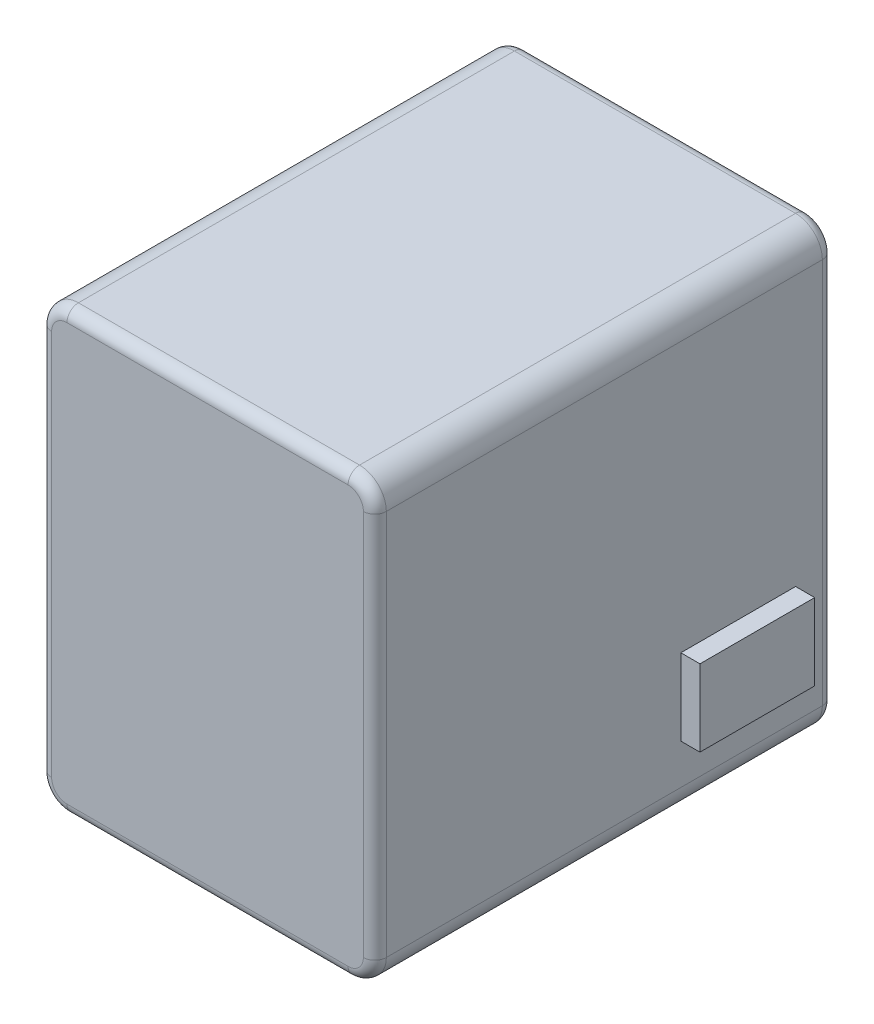
ISO-10303-21;
HEADER;
FILE_DESCRIPTION(('STEP AP214'),'2;1');
FILE_NAME('part.step','',(''),(''),'','','');
FILE_SCHEMA(('AUTOMOTIVE_DESIGN { 1 0 10303 214 1 1 1 1 }'));
ENDSEC;
DATA;
#1=APPLICATION_CONTEXT('core data for automotive mechanical design processes');
#2=APPLICATION_PROTOCOL_DEFINITION('international standard','automotive_design',2000,#1);
#3=PRODUCT_CONTEXT('',#1,'mechanical');
#4=PRODUCT('Part','Part','',(#3));
#5=PRODUCT_RELATED_PRODUCT_CATEGORY('part','',(#4));
#6=PRODUCT_DEFINITION_FORMATION('','',#4);
#7=PRODUCT_DEFINITION_CONTEXT('part definition',#1,'design');
#8=PRODUCT_DEFINITION('design','',#6,#7);
#9=PRODUCT_DEFINITION_SHAPE('','',#8);
#10=(LENGTH_UNIT() NAMED_UNIT(*) SI_UNIT(.MILLI.,.METRE.));
#11=(NAMED_UNIT(*) PLANE_ANGLE_UNIT() SI_UNIT($,.RADIAN.));
#12=(NAMED_UNIT(*) SI_UNIT($,.STERADIAN.) SOLID_ANGLE_UNIT());
#13=UNCERTAINTY_MEASURE_WITH_UNIT(LENGTH_MEASURE(1.E-05),#10,'distance_accuracy_value','');
#14=(GEOMETRIC_REPRESENTATION_CONTEXT(3) GLOBAL_UNCERTAINTY_ASSIGNED_CONTEXT((#13)) GLOBAL_UNIT_ASSIGNED_CONTEXT((#10,
#11,#12)) REPRESENTATION_CONTEXT('',''));
#15=CARTESIAN_POINT('',(0.,0.,0.));
#16=DIRECTION('',(0.,0.,1.));
#17=DIRECTION('',(1.,0.,0.));
#18=AXIS2_PLACEMENT_3D('',#15,#16,#17);
#19=CARTESIAN_POINT('',(855.,-40.,383.));
#20=DIRECTION('',(0.,0.,-1.));
#21=DIRECTION('',(-1.,0.,0.));
#22=AXIS2_PLACEMENT_3D('',#19,#20,#21);
#23=PLANE('',#22);
#24=DIRECTION('',(0.,-1.,0.));
#25=VECTOR('',#24,1.);
#26=CARTESIAN_POINT('',(845.,-40.,383.));
#27=LINE('',#26,#25);
#28=CARTESIAN_POINT('',(845.,-40.,383.));
#29=VERTEX_POINT('',#28);
#30=CARTESIAN_POINT('',(845.,-80.,383.));
#31=VERTEX_POINT('',#30);
#32=EDGE_CURVE('E265',#29,#31,#27,.T.);
#33=ORIENTED_EDGE('',*,*,#32,.T.);
#34=DIRECTION('',(-1.,0.,0.));
#35=VECTOR('',#34,1.);
#36=CARTESIAN_POINT('',(855.,-80.,383.));
#37=LINE('',#36,#35);
#38=CARTESIAN_POINT('',(855.,-80.,383.));
#39=VERTEX_POINT('',#38);
#40=EDGE_CURVE('E11',#39,#31,#37,.T.);
#41=ORIENTED_EDGE('',*,*,#40,.F.);
#42=DIRECTION('',(0.,-1.,0.));
#43=VECTOR('',#42,1.);
#44=CARTESIAN_POINT('',(855.,-40.,383.));
#45=LINE('',#44,#43);
#46=CARTESIAN_POINT('',(855.,-40.,383.));
#47=VERTEX_POINT('',#46);
#48=EDGE_CURVE('E304',#47,#39,#45,.T.);
#49=ORIENTED_EDGE('',*,*,#48,.F.);
#50=DIRECTION('',(-1.,0.,0.));
#51=VECTOR('',#50,1.);
#52=CARTESIAN_POINT('',(855.,-40.,383.));
#53=LINE('',#52,#51);
#54=EDGE_CURVE('E313',#47,#29,#53,.T.);
#55=ORIENTED_EDGE('',*,*,#54,.T.);
#56=EDGE_LOOP('',(#33,#41,#49,#55));
#57=FACE_BOUND('',#56,.T.);
#58=ADVANCED_FACE('F43',(#57),#23,.F.);
#59=CARTESIAN_POINT('',(855.,-80.,383.));
#60=DIRECTION('',(0.,1.,0.));
#61=DIRECTION('',(1.,0.,0.));
#62=AXIS2_PLACEMENT_3D('',#59,#60,#61);
#63=PLANE('',#62);
#64=DIRECTION('',(0.,0.,-1.));
#65=VECTOR('',#64,1.);
#66=CARTESIAN_POINT('',(845.,-80.,383.));
#67=LINE('',#66,#65);
#68=CARTESIAN_POINT('',(845.,-80.,323.));
#69=VERTEX_POINT('',#68);
#70=EDGE_CURVE('E314',#31,#69,#67,.T.);
#71=ORIENTED_EDGE('',*,*,#70,.T.);
#72=DIRECTION('',(-1.,0.,0.));
#73=VECTOR('',#72,1.);
#74=CARTESIAN_POINT('',(855.,-80.,323.));
#75=LINE('',#74,#73);
#76=CARTESIAN_POINT('',(855.,-80.,323.));
#77=VERTEX_POINT('',#76);
#78=EDGE_CURVE('E51',#77,#69,#75,.T.);
#79=ORIENTED_EDGE('',*,*,#78,.F.);
#80=DIRECTION('',(0.,0.,-1.));
#81=VECTOR('',#80,1.);
#82=CARTESIAN_POINT('',(855.,-80.,383.));
#83=LINE('',#82,#81);
#84=EDGE_CURVE('E305',#39,#77,#83,.T.);
#85=ORIENTED_EDGE('',*,*,#84,.F.);
#86=ORIENTED_EDGE('',*,*,#40,.T.);
#87=EDGE_LOOP('',(#71,#79,#85,#86));
#88=FACE_BOUND('',#87,.T.);
#89=ADVANCED_FACE('F331',(#88),#63,.F.);
#90=CARTESIAN_POINT('',(855.,-80.,323.));
#91=DIRECTION('',(0.,0.,1.));
#92=DIRECTION('',(1.,0.,0.));
#93=AXIS2_PLACEMENT_3D('',#90,#91,#92);
#94=PLANE('',#93);
#95=DIRECTION('',(0.,1.,0.));
#96=VECTOR('',#95,1.);
#97=CARTESIAN_POINT('',(845.,-80.,323.));
#98=LINE('',#97,#96);
#99=CARTESIAN_POINT('',(845.,-40.,323.));
#100=VERTEX_POINT('',#99);
#101=EDGE_CURVE('E320',#69,#100,#98,.T.);
#102=ORIENTED_EDGE('',*,*,#101,.T.);
#103=DIRECTION('',(-1.,0.,0.));
#104=VECTOR('',#103,1.);
#105=CARTESIAN_POINT('',(855.,-40.,323.));
#106=LINE('',#105,#104);
#107=CARTESIAN_POINT('',(855.,-40.,323.));
#108=VERTEX_POINT('',#107);
#109=EDGE_CURVE('E322',#108,#100,#106,.T.);
#110=ORIENTED_EDGE('',*,*,#109,.F.);
#111=DIRECTION('',(0.,1.,0.));
#112=VECTOR('',#111,1.);
#113=CARTESIAN_POINT('',(855.,-80.,323.));
#114=LINE('',#113,#112);
#115=EDGE_CURVE('E306',#77,#108,#114,.T.);
#116=ORIENTED_EDGE('',*,*,#115,.F.);
#117=ORIENTED_EDGE('',*,*,#78,.T.);
#118=EDGE_LOOP('',(#102,#110,#116,#117));
#119=FACE_BOUND('',#118,.T.);
#120=ADVANCED_FACE('F329',(#119),#94,.F.);
#121=CARTESIAN_POINT('',(855.,-40.,323.));
#122=DIRECTION('',(0.,-1.,0.));
#123=DIRECTION('',(-1.,0.,0.));
#124=AXIS2_PLACEMENT_3D('',#121,#122,#123);
#125=PLANE('',#124);
#126=DIRECTION('',(0.,0.,1.));
#127=VECTOR('',#126,1.);
#128=CARTESIAN_POINT('',(845.,-40.,323.));
#129=LINE('',#128,#127);
#130=EDGE_CURVE('E308',#100,#29,#129,.T.);
#131=ORIENTED_EDGE('',*,*,#130,.T.);
#132=ORIENTED_EDGE('',*,*,#54,.F.);
#133=DIRECTION('',(0.,0.,1.));
#134=VECTOR('',#133,1.);
#135=CARTESIAN_POINT('',(855.,-40.,323.));
#136=LINE('',#135,#134);
#137=EDGE_CURVE('E59',#108,#47,#136,.T.);
#138=ORIENTED_EDGE('',*,*,#137,.F.);
#139=ORIENTED_EDGE('',*,*,#109,.T.);
#140=EDGE_LOOP('',(#131,#132,#138,#139));
#141=FACE_BOUND('',#140,.T.);
#142=ADVANCED_FACE('F336',(#141),#125,.F.);
#143=CARTESIAN_POINT('',(855.,-60.,353.));
#144=DIRECTION('',(1.,0.,0.));
#145=DIRECTION('',(0.,0.,-1.));
#146=AXIS2_PLACEMENT_3D('',#143,#144,#145);
#147=PLANE('',#146);
#148=ORIENTED_EDGE('',*,*,#48,.T.);
#149=ORIENTED_EDGE('',*,*,#84,.T.);
#150=ORIENTED_EDGE('',*,*,#115,.T.);
#151=ORIENTED_EDGE('',*,*,#137,.T.);
#152=EDGE_LOOP('',(#148,#149,#150,#151));
#153=FACE_BOUND('',#152,.T.);
#154=ADVANCED_FACE('F344',(#153),#147,.T.);
#155=CARTESIAN_POINT('',(684.,-101.,543.));
#156=DIRECTION('',(0.,0.,-1.));
#157=DIRECTION('',(-1.,0.,0.));
#158=AXIS2_PLACEMENT_3D('',#155,#156,#157);
#159=CYLINDRICAL_SURFACE('',#158,13.9999999999999);
#160=DIRECTION('',(0.,0.,-1.));
#161=VECTOR('',#160,1.);
#162=CARTESIAN_POINT('',(684.,-115.,543.));
#163=LINE('',#162,#161);
#164=CARTESIAN_POINT('',(684.,-115.,537.));
#165=VERTEX_POINT('',#164);
#166=CARTESIAN_POINT('',(684.,-115.,309.));
#167=VERTEX_POINT('',#166);
#168=EDGE_CURVE('E198',#165,#167,#163,.T.);
#169=ORIENTED_EDGE('',*,*,#168,.F.);
#170=CARTESIAN_POINT('',(684.,-101.,537.));
#171=DIRECTION('',(0.,0.,1.));
#172=DIRECTION('',(1.,0.,0.));
#173=AXIS2_PLACEMENT_3D('',#170,#171,#172);
#174=CIRCLE('',#173,13.9999999999999);
#175=CARTESIAN_POINT('',(670.,-101.,537.));
#176=VERTEX_POINT('',#175);
#177=EDGE_CURVE('E185',#165,#176,#174,.F.);
#178=ORIENTED_EDGE('',*,*,#177,.T.);
#179=DIRECTION('',(0.,0.,-1.));
#180=VECTOR('',#179,1.);
#181=CARTESIAN_POINT('',(670.,-101.,543.));
#182=LINE('',#181,#180);
#183=CARTESIAN_POINT('',(670.,-101.,309.));
#184=VERTEX_POINT('',#183);
#185=EDGE_CURVE('E283',#176,#184,#182,.T.);
#186=ORIENTED_EDGE('',*,*,#185,.T.);
#187=CARTESIAN_POINT('',(684.,-101.,309.));
#188=DIRECTION('',(0.,0.,1.));
#189=DIRECTION('',(1.,0.,0.));
#190=AXIS2_PLACEMENT_3D('',#187,#188,#189);
#191=CIRCLE('',#190,13.9999999999999);
#192=EDGE_CURVE('E212',#184,#167,#191,.T.);
#193=ORIENTED_EDGE('',*,*,#192,.T.);
#194=EDGE_LOOP('',(#169,#178,#186,#193));
#195=FACE_BOUND('',#194,.T.);
#196=ADVANCED_FACE('F345',(#195),#159,.T.);
#197=CARTESIAN_POINT('',(684.,-115.,543.));
#198=DIRECTION('',(0.,1.,0.));
#199=DIRECTION('',(0.,0.,1.));
#200=AXIS2_PLACEMENT_3D('',#197,#198,#199);
#201=PLANE('',#200);
#202=ORIENTED_EDGE('',*,*,#168,.T.);
#203=DIRECTION('',(1.,0.,0.));
#204=VECTOR('',#203,1.);
#205=CARTESIAN_POINT('',(684.,-115.,309.));
#206=LINE('',#205,#204);
#207=CARTESIAN_POINT('',(831.,-115.,309.));
#208=VERTEX_POINT('',#207);
#209=EDGE_CURVE('E248',#167,#208,#206,.T.);
#210=ORIENTED_EDGE('',*,*,#209,.T.);
#211=DIRECTION('',(0.,0.,-1.));
#212=VECTOR('',#211,1.);
#213=CARTESIAN_POINT('',(831.,-115.,543.));
#214=LINE('',#213,#212);
#215=CARTESIAN_POINT('',(831.,-115.,537.));
#216=VERTEX_POINT('',#215);
#217=EDGE_CURVE('E698',#216,#208,#214,.T.);
#218=ORIENTED_EDGE('',*,*,#217,.F.);
#219=DIRECTION('',(1.,0.,0.));
#220=VECTOR('',#219,1.);
#221=CARTESIAN_POINT('',(684.,-115.,537.));
#222=LINE('',#221,#220);
#223=EDGE_CURVE('E247',#216,#165,#222,.F.);
#224=ORIENTED_EDGE('',*,*,#223,.T.);
#225=EDGE_LOOP('',(#202,#210,#218,#224));
#226=FACE_BOUND('',#225,.T.);
#227=ADVANCED_FACE('F354',(#226),#201,.F.);
#228=CARTESIAN_POINT('',(831.,-101.,543.));
#229=DIRECTION('',(0.,0.,-1.));
#230=DIRECTION('',(-1.,0.,0.));
#231=AXIS2_PLACEMENT_3D('',#228,#229,#230);
#232=CYLINDRICAL_SURFACE('',#231,14.);
#233=DIRECTION('',(0.,0.,-1.));
#234=VECTOR('',#233,1.);
#235=CARTESIAN_POINT('',(845.,-101.,543.));
#236=LINE('',#235,#234);
#237=CARTESIAN_POINT('',(845.,-101.,537.));
#238=VERTEX_POINT('',#237);
#239=CARTESIAN_POINT('',(845.,-101.,309.));
#240=VERTEX_POINT('',#239);
#241=EDGE_CURVE('E689',#238,#240,#236,.T.);
#242=ORIENTED_EDGE('',*,*,#241,.F.);
#243=CARTESIAN_POINT('',(831.,-101.,537.));
#244=DIRECTION('',(0.,0.,1.));
#245=DIRECTION('',(1.,0.,0.));
#246=AXIS2_PLACEMENT_3D('',#243,#244,#245);
#247=CIRCLE('',#246,14.);
#248=EDGE_CURVE('E227',#238,#216,#247,.F.);
#249=ORIENTED_EDGE('',*,*,#248,.T.);
#250=ORIENTED_EDGE('',*,*,#217,.T.);
#251=CARTESIAN_POINT('',(831.,-101.,309.));
#252=DIRECTION('',(0.,0.,1.));
#253=DIRECTION('',(1.,0.,0.));
#254=AXIS2_PLACEMENT_3D('',#251,#252,#253);
#255=CIRCLE('',#254,14.);
#256=EDGE_CURVE('E228',#208,#240,#255,.T.);
#257=ORIENTED_EDGE('',*,*,#256,.T.);
#258=EDGE_LOOP('',(#242,#249,#250,#257));
#259=FACE_BOUND('',#258,.T.);
#260=ADVANCED_FACE('F372',(#259),#232,.T.);
#261=CARTESIAN_POINT('',(845.,-101.,543.));
#262=DIRECTION('',(-1.,0.,0.));
#263=DIRECTION('',(0.,0.,1.));
#264=AXIS2_PLACEMENT_3D('',#261,#262,#263);
#265=PLANE('',#264);
#266=ORIENTED_EDGE('',*,*,#32,.F.);
#267=ORIENTED_EDGE('',*,*,#130,.F.);
#268=ORIENTED_EDGE('',*,*,#101,.F.);
#269=ORIENTED_EDGE('',*,*,#70,.F.);
#270=EDGE_LOOP('',(#266,#267,#268,#269));
#271=FACE_BOUND('',#270,.T.);
#272=DIRECTION('',(0.,0.,-1.));
#273=VECTOR('',#272,1.);
#274=CARTESIAN_POINT('',(845.,101.,543.));
#275=LINE('',#274,#273);
#276=CARTESIAN_POINT('',(845.,101.,537.));
#277=VERTEX_POINT('',#276);
#278=CARTESIAN_POINT('',(845.,101.,309.));
#279=VERTEX_POINT('',#278);
#280=EDGE_CURVE('E685',#277,#279,#275,.T.);
#281=ORIENTED_EDGE('',*,*,#280,.F.);
#282=DIRECTION('',(0.,1.,0.));
#283=VECTOR('',#282,1.);
#284=CARTESIAN_POINT('',(845.,-101.,537.));
#285=LINE('',#284,#283);
#286=EDGE_CURVE('E260',#277,#238,#285,.F.);
#287=ORIENTED_EDGE('',*,*,#286,.T.);
#288=ORIENTED_EDGE('',*,*,#241,.T.);
#289=DIRECTION('',(0.,1.,0.));
#290=VECTOR('',#289,1.);
#291=CARTESIAN_POINT('',(845.,-101.,309.));
#292=LINE('',#291,#290);
#293=EDGE_CURVE('E254',#240,#279,#292,.T.);
#294=ORIENTED_EDGE('',*,*,#293,.T.);
#295=EDGE_LOOP('',(#281,#287,#288,#294));
#296=FACE_BOUND('',#295,.T.);
#297=ADVANCED_FACE('F339',(#271,#296),#265,.F.);
#298=CARTESIAN_POINT('',(831.,101.,543.));
#299=DIRECTION('',(0.,0.,-1.));
#300=DIRECTION('',(-1.,0.,0.));
#301=AXIS2_PLACEMENT_3D('',#298,#299,#300);
#302=CYLINDRICAL_SURFACE('',#301,14.);
#303=DIRECTION('',(0.,0.,-1.));
#304=VECTOR('',#303,1.);
#305=CARTESIAN_POINT('',(831.,115.,543.));
#306=LINE('',#305,#304);
#307=CARTESIAN_POINT('',(831.,115.,537.));
#308=VERTEX_POINT('',#307);
#309=CARTESIAN_POINT('',(831.,115.,309.));
#310=VERTEX_POINT('',#309);
#311=EDGE_CURVE('E683',#308,#310,#306,.T.);
#312=ORIENTED_EDGE('',*,*,#311,.F.);
#313=CARTESIAN_POINT('',(831.,101.,537.));
#314=DIRECTION('',(0.,0.,1.));
#315=DIRECTION('',(1.,0.,0.));
#316=AXIS2_PLACEMENT_3D('',#313,#314,#315);
#317=CIRCLE('',#316,14.);
#318=EDGE_CURVE('E221',#308,#277,#317,.F.);
#319=ORIENTED_EDGE('',*,*,#318,.T.);
#320=ORIENTED_EDGE('',*,*,#280,.T.);
#321=CARTESIAN_POINT('',(831.,101.,309.));
#322=DIRECTION('',(0.,0.,1.));
#323=DIRECTION('',(1.,0.,0.));
#324=AXIS2_PLACEMENT_3D('',#321,#322,#323);
#325=CIRCLE('',#324,14.);
#326=EDGE_CURVE('E222',#279,#310,#325,.T.);
#327=ORIENTED_EDGE('',*,*,#326,.T.);
#328=EDGE_LOOP('',(#312,#319,#320,#327));
#329=FACE_BOUND('',#328,.T.);
#330=ADVANCED_FACE('F390',(#329),#302,.T.);
#331=CARTESIAN_POINT('',(831.,115.,543.));
#332=DIRECTION('',(0.,-1.,0.));
#333=DIRECTION('',(0.,0.,-1.));
#334=AXIS2_PLACEMENT_3D('',#331,#332,#333);
#335=PLANE('',#334);
#336=DIRECTION('',(0.,0.,-1.));
#337=VECTOR('',#336,1.);
#338=CARTESIAN_POINT('',(684.,115.,543.));
#339=LINE('',#338,#337);
#340=CARTESIAN_POINT('',(684.,115.,537.));
#341=VERTEX_POINT('',#340);
#342=CARTESIAN_POINT('',(684.,115.,309.));
#343=VERTEX_POINT('',#342);
#344=EDGE_CURVE('E686',#341,#343,#339,.T.);
#345=ORIENTED_EDGE('',*,*,#344,.F.);
#346=DIRECTION('',(-1.,0.,0.));
#347=VECTOR('',#346,1.);
#348=CARTESIAN_POINT('',(831.,115.,537.));
#349=LINE('',#348,#347);
#350=EDGE_CURVE('E261',#341,#308,#349,.F.);
#351=ORIENTED_EDGE('',*,*,#350,.T.);
#352=ORIENTED_EDGE('',*,*,#311,.T.);
#353=DIRECTION('',(-1.,0.,0.));
#354=VECTOR('',#353,1.);
#355=CARTESIAN_POINT('',(831.,115.,309.));
#356=LINE('',#355,#354);
#357=EDGE_CURVE('E259',#310,#343,#356,.T.);
#358=ORIENTED_EDGE('',*,*,#357,.T.);
#359=EDGE_LOOP('',(#345,#351,#352,#358));
#360=FACE_BOUND('',#359,.T.);
#361=ADVANCED_FACE('F392',(#360),#335,.F.);
#362=CARTESIAN_POINT('',(684.,101.,543.));
#363=DIRECTION('',(0.,0.,-1.));
#364=DIRECTION('',(-1.,0.,0.));
#365=AXIS2_PLACEMENT_3D('',#362,#363,#364);
#366=CYLINDRICAL_SURFACE('',#365,13.9999999999999);
#367=DIRECTION('',(0.,0.,-1.));
#368=VECTOR('',#367,1.);
#369=CARTESIAN_POINT('',(670.,101.,543.));
#370=LINE('',#369,#368);
#371=CARTESIAN_POINT('',(670.,101.,537.));
#372=VERTEX_POINT('',#371);
#373=CARTESIAN_POINT('',(670.,101.,309.));
#374=VERTEX_POINT('',#373);
#375=EDGE_CURVE('E690',#372,#374,#370,.T.);
#376=ORIENTED_EDGE('',*,*,#375,.F.);
#377=CARTESIAN_POINT('',(684.,101.,537.));
#378=DIRECTION('',(0.,0.,1.));
#379=DIRECTION('',(1.,0.,0.));
#380=AXIS2_PLACEMENT_3D('',#377,#378,#379);
#381=CIRCLE('',#380,13.9999999999999);
#382=EDGE_CURVE('E218',#372,#341,#381,.F.);
#383=ORIENTED_EDGE('',*,*,#382,.T.);
#384=ORIENTED_EDGE('',*,*,#344,.T.);
#385=CARTESIAN_POINT('',(684.,101.,309.));
#386=DIRECTION('',(0.,0.,1.));
#387=DIRECTION('',(1.,0.,0.));
#388=AXIS2_PLACEMENT_3D('',#385,#386,#387);
#389=CIRCLE('',#388,13.9999999999999);
#390=EDGE_CURVE('E220',#343,#374,#389,.T.);
#391=ORIENTED_EDGE('',*,*,#390,.T.);
#392=EDGE_LOOP('',(#376,#383,#384,#391));
#393=FACE_BOUND('',#392,.T.);
#394=ADVANCED_FACE('F400',(#393),#366,.T.);
#395=CARTESIAN_POINT('',(670.,101.,543.));
#396=DIRECTION('',(1.,0.,0.));
#397=DIRECTION('',(0.,0.,-1.));
#398=AXIS2_PLACEMENT_3D('',#395,#396,#397);
#399=PLANE('',#398);
#400=ORIENTED_EDGE('',*,*,#375,.T.);
#401=DIRECTION('',(0.,-1.,0.));
#402=VECTOR('',#401,1.);
#403=CARTESIAN_POINT('',(670.,101.,309.));
#404=LINE('',#403,#402);
#405=EDGE_CURVE('E251',#374,#184,#404,.T.);
#406=ORIENTED_EDGE('',*,*,#405,.T.);
#407=ORIENTED_EDGE('',*,*,#185,.F.);
#408=DIRECTION('',(0.,-1.,0.));
#409=VECTOR('',#408,1.);
#410=CARTESIAN_POINT('',(670.,101.,537.));
#411=LINE('',#410,#409);
#412=EDGE_CURVE('E253',#176,#372,#411,.F.);
#413=ORIENTED_EDGE('',*,*,#412,.T.);
#414=EDGE_LOOP('',(#400,#406,#407,#413));
#415=FACE_BOUND('',#414,.T.);
#416=ADVANCED_FACE('F409',(#415),#399,.F.);
#417=CARTESIAN_POINT('',(684.,-101.,543.));
#418=DIRECTION('',(0.,0.,1.));
#419=DIRECTION('',(1.,0.,0.));
#420=AXIS2_PLACEMENT_3D('',#417,#418,#419);
#421=PLANE('',#420);
#422=CARTESIAN_POINT('',(831.,101.,543.));
#423=DIRECTION('',(0.,0.,1.));
#424=DIRECTION('',(1.,0.,0.));
#425=AXIS2_PLACEMENT_3D('',#422,#423,#424);
#426=CIRCLE('',#425,8.00000000000002);
#427=CARTESIAN_POINT('',(839.,101.,543.));
#428=VERTEX_POINT('',#427);
#429=CARTESIAN_POINT('',(831.,109.,543.));
#430=VERTEX_POINT('',#429);
#431=EDGE_CURVE('E208',#428,#430,#426,.T.);
#432=ORIENTED_EDGE('',*,*,#431,.T.);
#433=DIRECTION('',(-1.,0.,0.));
#434=VECTOR('',#433,1.);
#435=CARTESIAN_POINT('',(684.,109.,543.));
#436=LINE('',#435,#434);
#437=CARTESIAN_POINT('',(684.,109.,543.));
#438=VERTEX_POINT('',#437);
#439=EDGE_CURVE('E215',#430,#438,#436,.T.);
#440=ORIENTED_EDGE('',*,*,#439,.T.);
#441=CARTESIAN_POINT('',(684.,101.,543.));
#442=DIRECTION('',(0.,0.,1.));
#443=DIRECTION('',(1.,0.,0.));
#444=AXIS2_PLACEMENT_3D('',#441,#442,#443);
#445=CIRCLE('',#444,7.99999999999992);
#446=CARTESIAN_POINT('',(676.,101.,543.));
#447=VERTEX_POINT('',#446);
#448=EDGE_CURVE('E209',#438,#447,#445,.T.);
#449=ORIENTED_EDGE('',*,*,#448,.T.);
#450=DIRECTION('',(0.,-1.,0.));
#451=VECTOR('',#450,1.);
#452=CARTESIAN_POINT('',(676.,-101.,543.));
#453=LINE('',#452,#451);
#454=CARTESIAN_POINT('',(676.,-101.,543.));
#455=VERTEX_POINT('',#454);
#456=EDGE_CURVE('E199',#447,#455,#453,.T.);
#457=ORIENTED_EDGE('',*,*,#456,.T.);
#458=CARTESIAN_POINT('',(684.,-101.,543.));
#459=DIRECTION('',(0.,0.,1.));
#460=DIRECTION('',(1.,0.,0.));
#461=AXIS2_PLACEMENT_3D('',#458,#459,#460);
#462=CIRCLE('',#461,7.99999999999992);
#463=CARTESIAN_POINT('',(684.,-109.,543.));
#464=VERTEX_POINT('',#463);
#465=EDGE_CURVE('E180',#455,#464,#462,.T.);
#466=ORIENTED_EDGE('',*,*,#465,.T.);
#467=DIRECTION('',(1.,0.,0.));
#468=VECTOR('',#467,1.);
#469=CARTESIAN_POINT('',(831.,-109.,543.));
#470=LINE('',#469,#468);
#471=CARTESIAN_POINT('',(831.,-109.,543.));
#472=VERTEX_POINT('',#471);
#473=EDGE_CURVE('E190',#464,#472,#470,.T.);
#474=ORIENTED_EDGE('',*,*,#473,.T.);
#475=CARTESIAN_POINT('',(831.,-101.,543.));
#476=DIRECTION('',(0.,0.,1.));
#477=DIRECTION('',(1.,0.,0.));
#478=AXIS2_PLACEMENT_3D('',#475,#476,#477);
#479=CIRCLE('',#478,8.00000000000002);
#480=CARTESIAN_POINT('',(839.,-101.,543.));
#481=VERTEX_POINT('',#480);
#482=EDGE_CURVE('E195',#472,#481,#479,.T.);
#483=ORIENTED_EDGE('',*,*,#482,.T.);
#484=DIRECTION('',(0.,1.,0.));
#485=VECTOR('',#484,1.);
#486=CARTESIAN_POINT('',(839.,101.,543.));
#487=LINE('',#486,#485);
#488=EDGE_CURVE('E201',#481,#428,#487,.T.);
#489=ORIENTED_EDGE('',*,*,#488,.T.);
#490=EDGE_LOOP('',(#432,#440,#449,#457,#466,#474,#483,#489));
#491=FACE_BOUND('',#490,.T.);
#492=ADVANCED_FACE('F196',(#491),#421,.T.);
#493=CARTESIAN_POINT('',(684.,-101.,303.));
#494=DIRECTION('',(0.,0.,1.));
#495=DIRECTION('',(1.,0.,0.));
#496=AXIS2_PLACEMENT_3D('',#493,#494,#495);
#497=PLANE('',#496);
#498=CARTESIAN_POINT('',(831.,101.,303.));
#499=DIRECTION('',(0.,0.,1.));
#500=DIRECTION('',(1.,0.,0.));
#501=AXIS2_PLACEMENT_3D('',#498,#499,#500);
#502=CIRCLE('',#501,8.00000000000002);
#503=CARTESIAN_POINT('',(831.,109.,303.));
#504=VERTEX_POINT('',#503);
#505=CARTESIAN_POINT('',(839.,101.,303.));
#506=VERTEX_POINT('',#505);
#507=EDGE_CURVE('E244',#504,#506,#502,.F.);
#508=ORIENTED_EDGE('',*,*,#507,.T.);
#509=DIRECTION('',(0.,1.,0.));
#510=VECTOR('',#509,1.);
#511=CARTESIAN_POINT('',(839.,-101.,303.));
#512=LINE('',#511,#510);
#513=CARTESIAN_POINT('',(839.,-101.,303.));
#514=VERTEX_POINT('',#513);
#515=EDGE_CURVE('E241',#506,#514,#512,.F.);
#516=ORIENTED_EDGE('',*,*,#515,.T.);
#517=CARTESIAN_POINT('',(831.,-101.,303.));
#518=DIRECTION('',(0.,0.,1.));
#519=DIRECTION('',(1.,0.,0.));
#520=AXIS2_PLACEMENT_3D('',#517,#518,#519);
#521=CIRCLE('',#520,8.00000000000002);
#522=CARTESIAN_POINT('',(831.,-109.,303.));
#523=VERTEX_POINT('',#522);
#524=EDGE_CURVE('E238',#514,#523,#521,.F.);
#525=ORIENTED_EDGE('',*,*,#524,.T.);
#526=DIRECTION('',(1.,0.,0.));
#527=VECTOR('',#526,1.);
#528=CARTESIAN_POINT('',(684.,-109.,303.));
#529=LINE('',#528,#527);
#530=CARTESIAN_POINT('',(684.,-109.,303.));
#531=VERTEX_POINT('',#530);
#532=EDGE_CURVE('E236',#523,#531,#529,.F.);
#533=ORIENTED_EDGE('',*,*,#532,.T.);
#534=CARTESIAN_POINT('',(684.,-101.,303.));
#535=DIRECTION('',(0.,0.,1.));
#536=DIRECTION('',(1.,0.,0.));
#537=AXIS2_PLACEMENT_3D('',#534,#535,#536);
#538=CIRCLE('',#537,7.99999999999992);
#539=CARTESIAN_POINT('',(676.,-101.,303.));
#540=VERTEX_POINT('',#539);
#541=EDGE_CURVE('E237',#531,#540,#538,.F.);
#542=ORIENTED_EDGE('',*,*,#541,.T.);
#543=DIRECTION('',(0.,-1.,0.));
#544=VECTOR('',#543,1.);
#545=CARTESIAN_POINT('',(676.,-101.,303.));
#546=LINE('',#545,#544);
#547=CARTESIAN_POINT('',(676.,101.,303.));
#548=VERTEX_POINT('',#547);
#549=EDGE_CURVE('E233',#540,#548,#546,.F.);
#550=ORIENTED_EDGE('',*,*,#549,.T.);
#551=CARTESIAN_POINT('',(684.,101.,303.));
#552=DIRECTION('',(0.,0.,1.));
#553=DIRECTION('',(1.,0.,0.));
#554=AXIS2_PLACEMENT_3D('',#551,#552,#553);
#555=CIRCLE('',#554,7.99999999999992);
#556=CARTESIAN_POINT('',(684.,109.,303.));
#557=VERTEX_POINT('',#556);
#558=EDGE_CURVE('E232',#548,#557,#555,.F.);
#559=ORIENTED_EDGE('',*,*,#558,.T.);
#560=DIRECTION('',(-1.,0.,0.));
#561=VECTOR('',#560,1.);
#562=CARTESIAN_POINT('',(684.,109.,303.));
#563=LINE('',#562,#561);
#564=EDGE_CURVE('E226',#557,#504,#563,.F.);
#565=ORIENTED_EDGE('',*,*,#564,.T.);
#566=EDGE_LOOP('',(#508,#516,#525,#533,#542,#550,#559,#565));
#567=FACE_BOUND('',#566,.T.);
#568=ADVANCED_FACE('F419',(#567),#497,.F.);
#569=CARTESIAN_POINT('',(831.,101.,537.));
#570=DIRECTION('',(0.,0.,1.));
#571=DIRECTION('',(1.,0.,0.));
#572=AXIS2_PLACEMENT_3D('',#569,#570,#571);
#573=TOROIDAL_SURFACE('',#572,8.00000000000002,6.);
#574=CARTESIAN_POINT('',(839.,101.,537.));
#575=DIRECTION('',(0.,-1.,0.));
#576=DIRECTION('',(1.,0.,0.));
#577=AXIS2_PLACEMENT_3D('',#574,#575,#576);
#578=CIRCLE('',#577,6.);
#579=EDGE_CURVE('E274',#277,#428,#578,.T.);
#580=ORIENTED_EDGE('',*,*,#579,.F.);
#581=ORIENTED_EDGE('',*,*,#318,.F.);
#582=CARTESIAN_POINT('',(831.,109.,537.));
#583=DIRECTION('',(-1.,0.,0.));
#584=DIRECTION('',(0.,0.,1.));
#585=AXIS2_PLACEMENT_3D('',#582,#583,#584);
#586=CIRCLE('',#585,6.);
#587=EDGE_CURVE('E279',#430,#308,#586,.T.);
#588=ORIENTED_EDGE('',*,*,#587,.F.);
#589=ORIENTED_EDGE('',*,*,#431,.F.);
#590=EDGE_LOOP('',(#580,#581,#588,#589));
#591=FACE_BOUND('',#590,.T.);
#592=ADVANCED_FACE('F426',(#591),#573,.T.);
#593=CARTESIAN_POINT('',(684.,109.,537.));
#594=DIRECTION('',(1.,0.,0.));
#595=DIRECTION('',(0.,0.,-1.));
#596=AXIS2_PLACEMENT_3D('',#593,#594,#595);
#597=CYLINDRICAL_SURFACE('',#596,6.);
#598=ORIENTED_EDGE('',*,*,#587,.T.);
#599=ORIENTED_EDGE('',*,*,#350,.F.);
#600=CARTESIAN_POINT('',(684.,109.,537.));
#601=DIRECTION('',(-1.,0.,0.));
#602=DIRECTION('',(0.,0.,1.));
#603=AXIS2_PLACEMENT_3D('',#600,#601,#602);
#604=CIRCLE('',#603,6.);
#605=EDGE_CURVE('E275',#438,#341,#604,.T.);
#606=ORIENTED_EDGE('',*,*,#605,.F.);
#607=ORIENTED_EDGE('',*,*,#439,.F.);
#608=EDGE_LOOP('',(#598,#599,#606,#607));
#609=FACE_BOUND('',#608,.T.);
#610=ADVANCED_FACE('F433',(#609),#597,.T.);
#611=CARTESIAN_POINT('',(839.,-101.,537.));
#612=DIRECTION('',(0.,-1.,0.));
#613=DIRECTION('',(0.,0.,-1.));
#614=AXIS2_PLACEMENT_3D('',#611,#612,#613);
#615=CYLINDRICAL_SURFACE('',#614,6.);
#616=ORIENTED_EDGE('',*,*,#579,.T.);
#617=ORIENTED_EDGE('',*,*,#488,.F.);
#618=CARTESIAN_POINT('',(839.,-101.,537.));
#619=DIRECTION('',(0.,-1.,0.));
#620=DIRECTION('',(0.,0.,-1.));
#621=AXIS2_PLACEMENT_3D('',#618,#619,#620);
#622=CIRCLE('',#621,6.);
#623=EDGE_CURVE('E267',#238,#481,#622,.T.);
#624=ORIENTED_EDGE('',*,*,#623,.F.);
#625=ORIENTED_EDGE('',*,*,#286,.F.);
#626=EDGE_LOOP('',(#616,#617,#624,#625));
#627=FACE_BOUND('',#626,.T.);
#628=ADVANCED_FACE('F439',(#627),#615,.T.);
#629=CARTESIAN_POINT('',(684.,101.,537.));
#630=DIRECTION('',(0.,0.,1.));
#631=DIRECTION('',(1.,0.,0.));
#632=AXIS2_PLACEMENT_3D('',#629,#630,#631);
#633=TOROIDAL_SURFACE('',#632,7.99999999999992,6.);
#634=ORIENTED_EDGE('',*,*,#605,.T.);
#635=ORIENTED_EDGE('',*,*,#382,.F.);
#636=CARTESIAN_POINT('',(676.,101.,537.));
#637=DIRECTION('',(0.,-1.,0.));
#638=DIRECTION('',(1.,0.,0.));
#639=AXIS2_PLACEMENT_3D('',#636,#637,#638);
#640=CIRCLE('',#639,6.);
#641=EDGE_CURVE('E266',#447,#372,#640,.T.);
#642=ORIENTED_EDGE('',*,*,#641,.F.);
#643=ORIENTED_EDGE('',*,*,#448,.F.);
#644=EDGE_LOOP('',(#634,#635,#642,#643));
#645=FACE_BOUND('',#644,.T.);
#646=ADVANCED_FACE('F449',(#645),#633,.T.);
#647=CARTESIAN_POINT('',(831.,-101.,537.));
#648=DIRECTION('',(0.,0.,1.));
#649=DIRECTION('',(1.,0.,0.));
#650=AXIS2_PLACEMENT_3D('',#647,#648,#649);
#651=TOROIDAL_SURFACE('',#650,8.00000000000002,6.);
#652=ORIENTED_EDGE('',*,*,#623,.T.);
#653=ORIENTED_EDGE('',*,*,#482,.F.);
#654=CARTESIAN_POINT('',(831.,-109.,537.));
#655=DIRECTION('',(-1.,0.,0.));
#656=DIRECTION('',(0.,0.,1.));
#657=AXIS2_PLACEMENT_3D('',#654,#655,#656);
#658=CIRCLE('',#657,6.);
#659=EDGE_CURVE('E192',#216,#472,#658,.T.);
#660=ORIENTED_EDGE('',*,*,#659,.F.);
#661=ORIENTED_EDGE('',*,*,#248,.F.);
#662=EDGE_LOOP('',(#652,#653,#660,#661));
#663=FACE_BOUND('',#662,.T.);
#664=ADVANCED_FACE('F453',(#663),#651,.T.);
#665=CARTESIAN_POINT('',(676.,-101.,537.));
#666=DIRECTION('',(0.,1.,0.));
#667=DIRECTION('',(0.,0.,1.));
#668=AXIS2_PLACEMENT_3D('',#665,#666,#667);
#669=CYLINDRICAL_SURFACE('',#668,6.);
#670=ORIENTED_EDGE('',*,*,#641,.T.);
#671=ORIENTED_EDGE('',*,*,#412,.F.);
#672=CARTESIAN_POINT('',(676.,-101.,537.));
#673=DIRECTION('',(0.,-1.,0.));
#674=DIRECTION('',(1.,0.,0.));
#675=AXIS2_PLACEMENT_3D('',#672,#673,#674);
#676=CIRCLE('',#675,6.);
#677=EDGE_CURVE('E183',#455,#176,#676,.T.);
#678=ORIENTED_EDGE('',*,*,#677,.F.);
#679=ORIENTED_EDGE('',*,*,#456,.F.);
#680=EDGE_LOOP('',(#670,#671,#678,#679));
#681=FACE_BOUND('',#680,.T.);
#682=ADVANCED_FACE('F463',(#681),#669,.T.);
#683=CARTESIAN_POINT('',(684.,-109.,537.));
#684=DIRECTION('',(-1.,0.,0.));
#685=DIRECTION('',(0.,0.,1.));
#686=AXIS2_PLACEMENT_3D('',#683,#684,#685);
#687=CYLINDRICAL_SURFACE('',#686,6.);
#688=ORIENTED_EDGE('',*,*,#659,.T.);
#689=ORIENTED_EDGE('',*,*,#473,.F.);
#690=CARTESIAN_POINT('',(684.,-109.,537.));
#691=DIRECTION('',(-1.,0.,0.));
#692=DIRECTION('',(0.,0.,1.));
#693=AXIS2_PLACEMENT_3D('',#690,#691,#692);
#694=CIRCLE('',#693,6.);
#695=EDGE_CURVE('E176',#165,#464,#694,.T.);
#696=ORIENTED_EDGE('',*,*,#695,.F.);
#697=ORIENTED_EDGE('',*,*,#223,.F.);
#698=EDGE_LOOP('',(#688,#689,#696,#697));
#699=FACE_BOUND('',#698,.T.);
#700=ADVANCED_FACE('F186',(#699),#687,.T.);
#701=CARTESIAN_POINT('',(684.,-101.,537.));
#702=DIRECTION('',(0.,0.,1.));
#703=DIRECTION('',(1.,0.,0.));
#704=AXIS2_PLACEMENT_3D('',#701,#702,#703);
#705=TOROIDAL_SURFACE('',#704,7.99999999999992,6.);
#706=ORIENTED_EDGE('',*,*,#677,.T.);
#707=ORIENTED_EDGE('',*,*,#177,.F.);
#708=ORIENTED_EDGE('',*,*,#695,.T.);
#709=ORIENTED_EDGE('',*,*,#465,.F.);
#710=EDGE_LOOP('',(#706,#707,#708,#709));
#711=FACE_BOUND('',#710,.T.);
#712=ADVANCED_FACE('F179',(#711),#705,.T.);
#713=CARTESIAN_POINT('',(684.,-101.,309.));
#714=DIRECTION('',(0.,0.,1.));
#715=DIRECTION('',(1.,0.,0.));
#716=AXIS2_PLACEMENT_3D('',#713,#714,#715);
#717=TOROIDAL_SURFACE('',#716,7.99999999999992,6.);
#718=CARTESIAN_POINT('',(676.,-101.,309.));
#719=DIRECTION('',(0.,1.,0.));
#720=DIRECTION('',(-1.,0.,0.));
#721=AXIS2_PLACEMENT_3D('',#718,#719,#720);
#722=CIRCLE('',#721,6.);
#723=EDGE_CURVE('E297',#540,#184,#722,.T.);
#724=ORIENTED_EDGE('',*,*,#723,.F.);
#725=ORIENTED_EDGE('',*,*,#541,.F.);
#726=CARTESIAN_POINT('',(684.,-109.,309.));
#727=DIRECTION('',(1.,0.,0.));
#728=DIRECTION('',(0.,0.,-1.));
#729=AXIS2_PLACEMENT_3D('',#726,#727,#728);
#730=CIRCLE('',#729,6.);
#731=EDGE_CURVE('E188',#167,#531,#730,.T.);
#732=ORIENTED_EDGE('',*,*,#731,.F.);
#733=ORIENTED_EDGE('',*,*,#192,.F.);
#734=EDGE_LOOP('',(#724,#725,#732,#733));
#735=FACE_BOUND('',#734,.T.);
#736=ADVANCED_FACE('F479',(#735),#717,.T.);
#737=CARTESIAN_POINT('',(684.,-109.,309.));
#738=DIRECTION('',(1.,0.,0.));
#739=DIRECTION('',(0.,0.,-1.));
#740=AXIS2_PLACEMENT_3D('',#737,#738,#739);
#741=CYLINDRICAL_SURFACE('',#740,6.);
#742=ORIENTED_EDGE('',*,*,#731,.T.);
#743=ORIENTED_EDGE('',*,*,#532,.F.);
#744=CARTESIAN_POINT('',(831.,-109.,309.));
#745=DIRECTION('',(1.,0.,0.));
#746=DIRECTION('',(0.,0.,-1.));
#747=AXIS2_PLACEMENT_3D('',#744,#745,#746);
#748=CIRCLE('',#747,6.);
#749=EDGE_CURVE('E293',#208,#523,#748,.T.);
#750=ORIENTED_EDGE('',*,*,#749,.F.);
#751=ORIENTED_EDGE('',*,*,#209,.F.);
#752=EDGE_LOOP('',(#742,#743,#750,#751));
#753=FACE_BOUND('',#752,.T.);
#754=ADVANCED_FACE('F484',(#753),#741,.T.);
#755=CARTESIAN_POINT('',(676.,101.,309.));
#756=DIRECTION('',(0.,-1.,0.));
#757=DIRECTION('',(0.,0.,-1.));
#758=AXIS2_PLACEMENT_3D('',#755,#756,#757);
#759=CYLINDRICAL_SURFACE('',#758,6.);
#760=ORIENTED_EDGE('',*,*,#723,.T.);
#761=ORIENTED_EDGE('',*,*,#405,.F.);
#762=CARTESIAN_POINT('',(676.,101.,309.));
#763=DIRECTION('',(0.,1.,0.));
#764=DIRECTION('',(0.,0.,1.));
#765=AXIS2_PLACEMENT_3D('',#762,#763,#764);
#766=CIRCLE('',#765,6.);
#767=EDGE_CURVE('E295',#548,#374,#766,.T.);
#768=ORIENTED_EDGE('',*,*,#767,.F.);
#769=ORIENTED_EDGE('',*,*,#549,.F.);
#770=EDGE_LOOP('',(#760,#761,#768,#769));
#771=FACE_BOUND('',#770,.T.);
#772=ADVANCED_FACE('F491',(#771),#759,.T.);
#773=CARTESIAN_POINT('',(831.,-101.,309.));
#774=DIRECTION('',(0.,0.,1.));
#775=DIRECTION('',(1.,0.,0.));
#776=AXIS2_PLACEMENT_3D('',#773,#774,#775);
#777=TOROIDAL_SURFACE('',#776,8.00000000000002,6.);
#778=ORIENTED_EDGE('',*,*,#749,.T.);
#779=ORIENTED_EDGE('',*,*,#524,.F.);
#780=CARTESIAN_POINT('',(839.,-101.,309.));
#781=DIRECTION('',(0.,1.,0.));
#782=DIRECTION('',(0.,0.,1.));
#783=AXIS2_PLACEMENT_3D('',#780,#781,#782);
#784=CIRCLE('',#783,6.);
#785=EDGE_CURVE('E288',#240,#514,#784,.T.);
#786=ORIENTED_EDGE('',*,*,#785,.F.);
#787=ORIENTED_EDGE('',*,*,#256,.F.);
#788=EDGE_LOOP('',(#778,#779,#786,#787));
#789=FACE_BOUND('',#788,.T.);
#790=ADVANCED_FACE('F499',(#789),#777,.T.);
#791=CARTESIAN_POINT('',(684.,101.,309.));
#792=DIRECTION('',(0.,0.,1.));
#793=DIRECTION('',(1.,0.,0.));
#794=AXIS2_PLACEMENT_3D('',#791,#792,#793);
#795=TOROIDAL_SURFACE('',#794,7.99999999999992,6.);
#796=ORIENTED_EDGE('',*,*,#767,.T.);
#797=ORIENTED_EDGE('',*,*,#390,.F.);
#798=CARTESIAN_POINT('',(684.,109.,309.));
#799=DIRECTION('',(1.,0.,0.));
#800=DIRECTION('',(0.,0.,-1.));
#801=AXIS2_PLACEMENT_3D('',#798,#799,#800);
#802=CIRCLE('',#801,6.);
#803=EDGE_CURVE('E286',#557,#343,#802,.T.);
#804=ORIENTED_EDGE('',*,*,#803,.F.);
#805=ORIENTED_EDGE('',*,*,#558,.F.);
#806=EDGE_LOOP('',(#796,#797,#804,#805));
#807=FACE_BOUND('',#806,.T.);
#808=ADVANCED_FACE('F501',(#807),#795,.T.);
#809=CARTESIAN_POINT('',(839.,-101.,309.));
#810=DIRECTION('',(0.,1.,0.));
#811=DIRECTION('',(0.,0.,1.));
#812=AXIS2_PLACEMENT_3D('',#809,#810,#811);
#813=CYLINDRICAL_SURFACE('',#812,6.);
#814=ORIENTED_EDGE('',*,*,#785,.T.);
#815=ORIENTED_EDGE('',*,*,#515,.F.);
#816=CARTESIAN_POINT('',(839.,101.,309.));
#817=DIRECTION('',(0.,1.,0.));
#818=DIRECTION('',(0.,0.,1.));
#819=AXIS2_PLACEMENT_3D('',#816,#817,#818);
#820=CIRCLE('',#819,6.);
#821=EDGE_CURVE('E285',#279,#506,#820,.T.);
#822=ORIENTED_EDGE('',*,*,#821,.F.);
#823=ORIENTED_EDGE('',*,*,#293,.F.);
#824=EDGE_LOOP('',(#814,#815,#822,#823));
#825=FACE_BOUND('',#824,.T.);
#826=ADVANCED_FACE('F515',(#825),#813,.T.);
#827=CARTESIAN_POINT('',(831.,109.,309.));
#828=DIRECTION('',(-1.,0.,0.));
#829=DIRECTION('',(0.,0.,1.));
#830=AXIS2_PLACEMENT_3D('',#827,#828,#829);
#831=CYLINDRICAL_SURFACE('',#830,6.);
#832=ORIENTED_EDGE('',*,*,#803,.T.);
#833=ORIENTED_EDGE('',*,*,#357,.F.);
#834=CARTESIAN_POINT('',(831.,109.,309.));
#835=DIRECTION('',(1.,0.,0.));
#836=DIRECTION('',(0.,0.,-1.));
#837=AXIS2_PLACEMENT_3D('',#834,#835,#836);
#838=CIRCLE('',#837,6.);
#839=EDGE_CURVE('E284',#504,#310,#838,.T.);
#840=ORIENTED_EDGE('',*,*,#839,.F.);
#841=ORIENTED_EDGE('',*,*,#564,.F.);
#842=EDGE_LOOP('',(#832,#833,#840,#841));
#843=FACE_BOUND('',#842,.T.);
#844=ADVANCED_FACE('F520',(#843),#831,.T.);
#845=CARTESIAN_POINT('',(831.,101.,309.));
#846=DIRECTION('',(0.,0.,1.));
#847=DIRECTION('',(1.,0.,0.));
#848=AXIS2_PLACEMENT_3D('',#845,#846,#847);
#849=TOROIDAL_SURFACE('',#848,8.00000000000002,6.);
#850=ORIENTED_EDGE('',*,*,#821,.T.);
#851=ORIENTED_EDGE('',*,*,#507,.F.);
#852=ORIENTED_EDGE('',*,*,#839,.T.);
#853=ORIENTED_EDGE('',*,*,#326,.F.);
#854=EDGE_LOOP('',(#850,#851,#852,#853));
#855=FACE_BOUND('',#854,.T.);
#856=ADVANCED_FACE('F528',(#855),#849,.T.);
#857=CLOSED_SHELL('',(#58,#89,#120,#142,#154,#196,#227,#260,#297,#330,#361,#394,#416,#492,#568,
#592,#610,#628,#646,#664,#682,#700,#712,#736,#754,#772,#790,#808,#826,#844,#856));
#858=MANIFOLD_SOLID_BREP('B2',#857);
#859=ADVANCED_BREP_SHAPE_REPRESENTATION('',(#18,#858),#14);
#860=SHAPE_DEFINITION_REPRESENTATION(#9,#859);
ENDSEC;
END-ISO-10303-21;
